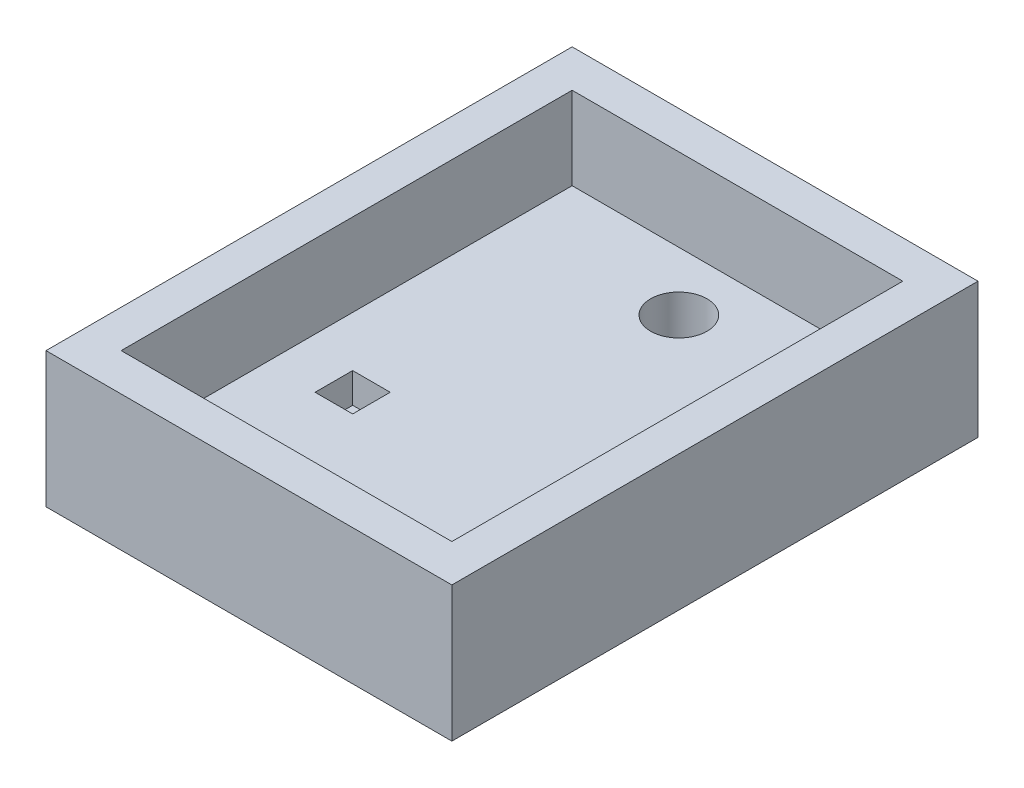
ISO-10303-21;
HEADER;
FILE_DESCRIPTION(('STEP AP214'),'2;1');
FILE_NAME('part.step','',(''),(''),'','','');
FILE_SCHEMA(('AUTOMOTIVE_DESIGN { 1 0 10303 214 1 1 1 1 }'));
ENDSEC;
DATA;
#1=APPLICATION_CONTEXT('core data for automotive mechanical design processes');
#2=APPLICATION_PROTOCOL_DEFINITION('international standard','automotive_design',2000,#1);
#3=PRODUCT_CONTEXT('',#1,'mechanical');
#4=PRODUCT('Part','Part','',(#3));
#5=PRODUCT_RELATED_PRODUCT_CATEGORY('part','',(#4));
#6=PRODUCT_DEFINITION_FORMATION('','',#4);
#7=PRODUCT_DEFINITION_CONTEXT('part definition',#1,'design');
#8=PRODUCT_DEFINITION('design','',#6,#7);
#9=PRODUCT_DEFINITION_SHAPE('','',#8);
#10=(LENGTH_UNIT() NAMED_UNIT(*) SI_UNIT(.MILLI.,.METRE.));
#11=(NAMED_UNIT(*) PLANE_ANGLE_UNIT() SI_UNIT($,.RADIAN.));
#12=(NAMED_UNIT(*) SI_UNIT($,.STERADIAN.) SOLID_ANGLE_UNIT());
#13=UNCERTAINTY_MEASURE_WITH_UNIT(LENGTH_MEASURE(1.E-05),#10,'distance_accuracy_value','');
#14=(GEOMETRIC_REPRESENTATION_CONTEXT(3) GLOBAL_UNCERTAINTY_ASSIGNED_CONTEXT((#13)) GLOBAL_UNIT_ASSIGNED_CONTEXT((#10,
#11,#12)) REPRESENTATION_CONTEXT('',''));
#15=CARTESIAN_POINT('',(0.,0.,0.));
#16=DIRECTION('',(0.,0.,1.));
#17=DIRECTION('',(1.,0.,0.));
#18=AXIS2_PLACEMENT_3D('',#15,#16,#17);
#19=CARTESIAN_POINT('',(0.,22.86,0.));
#20=DIRECTION('',(1.,0.,0.));
#21=DIRECTION('',(0.,0.,-1.));
#22=AXIS2_PLACEMENT_3D('',#19,#20,#21);
#23=PLANE('',#22);
#24=DIRECTION('',(0.,0.,1.));
#25=VECTOR('',#24,1.);
#26=CARTESIAN_POINT('',(0.,0.,0.));
#27=LINE('',#26,#25);
#28=CARTESIAN_POINT('',(0.,0.,-88.9));
#29=VERTEX_POINT('',#28);
#30=CARTESIAN_POINT('',(0.,0.,0.));
#31=VERTEX_POINT('',#30);
#32=EDGE_CURVE('E365',#29,#31,#27,.T.);
#33=ORIENTED_EDGE('',*,*,#32,.T.);
#34=DIRECTION('',(0.,-1.,0.));
#35=VECTOR('',#34,1.);
#36=CARTESIAN_POINT('',(0.,22.86,0.));
#37=LINE('',#36,#35);
#38=CARTESIAN_POINT('',(0.,22.86,0.));
#39=VERTEX_POINT('',#38);
#40=EDGE_CURVE('E12',#39,#31,#37,.T.);
#41=ORIENTED_EDGE('',*,*,#40,.F.);
#42=DIRECTION('',(0.,0.,1.));
#43=VECTOR('',#42,1.);
#44=CARTESIAN_POINT('',(0.,22.86,0.));
#45=LINE('',#44,#43);
#46=CARTESIAN_POINT('',(0.,22.86,-88.9));
#47=VERTEX_POINT('',#46);
#48=EDGE_CURVE('E366',#47,#39,#45,.T.);
#49=ORIENTED_EDGE('',*,*,#48,.F.);
#50=DIRECTION('',(0.,-1.,0.));
#51=VECTOR('',#50,1.);
#52=CARTESIAN_POINT('',(0.,22.86,-88.9));
#53=LINE('',#52,#51);
#54=EDGE_CURVE('E376',#47,#29,#53,.T.);
#55=ORIENTED_EDGE('',*,*,#54,.T.);
#56=EDGE_LOOP('',(#33,#41,#49,#55));
#57=FACE_BOUND('',#56,.T.);
#58=ADVANCED_FACE('F37',(#57),#23,.F.);
#59=CARTESIAN_POINT('',(0.,22.86,0.));
#60=DIRECTION('',(0.,0.,-1.));
#61=DIRECTION('',(-1.,0.,0.));
#62=AXIS2_PLACEMENT_3D('',#59,#60,#61);
#63=PLANE('',#62);
#64=DIRECTION('',(1.,0.,0.));
#65=VECTOR('',#64,1.);
#66=CARTESIAN_POINT('',(0.,0.,0.));
#67=LINE('',#66,#65);
#68=CARTESIAN_POINT('',(68.58,0.,0.));
#69=VERTEX_POINT('',#68);
#70=EDGE_CURVE('E379',#31,#69,#67,.T.);
#71=ORIENTED_EDGE('',*,*,#70,.T.);
#72=DIRECTION('',(0.,-1.,0.));
#73=VECTOR('',#72,1.);
#74=CARTESIAN_POINT('',(68.58,22.86,0.));
#75=LINE('',#74,#73);
#76=CARTESIAN_POINT('',(68.58,22.86,0.));
#77=VERTEX_POINT('',#76);
#78=EDGE_CURVE('E44',#77,#69,#75,.T.);
#79=ORIENTED_EDGE('',*,*,#78,.F.);
#80=DIRECTION('',(1.,0.,0.));
#81=VECTOR('',#80,1.);
#82=CARTESIAN_POINT('',(0.,22.86,0.));
#83=LINE('',#82,#81);
#84=EDGE_CURVE('E369',#39,#77,#83,.T.);
#85=ORIENTED_EDGE('',*,*,#84,.F.);
#86=ORIENTED_EDGE('',*,*,#40,.T.);
#87=EDGE_LOOP('',(#71,#79,#85,#86));
#88=FACE_BOUND('',#87,.T.);
#89=ADVANCED_FACE('F408',(#88),#63,.F.);
#90=CARTESIAN_POINT('',(68.58,22.86,0.));
#91=DIRECTION('',(-1.,0.,0.));
#92=DIRECTION('',(0.,0.,1.));
#93=AXIS2_PLACEMENT_3D('',#90,#91,#92);
#94=PLANE('',#93);
#95=DIRECTION('',(0.,0.,-1.));
#96=VECTOR('',#95,1.);
#97=CARTESIAN_POINT('',(68.58,0.,0.));
#98=LINE('',#97,#96);
#99=CARTESIAN_POINT('',(68.58,0.,-88.9));
#100=VERTEX_POINT('',#99);
#101=EDGE_CURVE('E381',#69,#100,#98,.T.);
#102=ORIENTED_EDGE('',*,*,#101,.T.);
#103=DIRECTION('',(0.,-1.,0.));
#104=VECTOR('',#103,1.);
#105=CARTESIAN_POINT('',(68.58,22.86,-88.9));
#106=LINE('',#105,#104);
#107=CARTESIAN_POINT('',(68.58,22.86,-88.9));
#108=VERTEX_POINT('',#107);
#109=EDGE_CURVE('E386',#108,#100,#106,.T.);
#110=ORIENTED_EDGE('',*,*,#109,.F.);
#111=DIRECTION('',(0.,0.,-1.));
#112=VECTOR('',#111,1.);
#113=CARTESIAN_POINT('',(68.58,22.86,0.));
#114=LINE('',#113,#112);
#115=EDGE_CURVE('E372',#77,#108,#114,.T.);
#116=ORIENTED_EDGE('',*,*,#115,.F.);
#117=ORIENTED_EDGE('',*,*,#78,.T.);
#118=EDGE_LOOP('',(#102,#110,#116,#117));
#119=FACE_BOUND('',#118,.T.);
#120=ADVANCED_FACE('F393',(#119),#94,.F.);
#121=CARTESIAN_POINT('',(0.,22.86,-88.9));
#122=DIRECTION('',(0.,0.,1.));
#123=DIRECTION('',(1.,0.,0.));
#124=AXIS2_PLACEMENT_3D('',#121,#122,#123);
#125=PLANE('',#124);
#126=DIRECTION('',(-1.,0.,0.));
#127=VECTOR('',#126,1.);
#128=CARTESIAN_POINT('',(0.,0.,-88.9));
#129=LINE('',#128,#127);
#130=EDGE_CURVE('E370',#100,#29,#129,.T.);
#131=ORIENTED_EDGE('',*,*,#130,.T.);
#132=ORIENTED_EDGE('',*,*,#54,.F.);
#133=DIRECTION('',(-1.,0.,0.));
#134=VECTOR('',#133,1.);
#135=CARTESIAN_POINT('',(0.,22.86,-88.9));
#136=LINE('',#135,#134);
#137=EDGE_CURVE('E374',#108,#47,#136,.T.);
#138=ORIENTED_EDGE('',*,*,#137,.F.);
#139=ORIENTED_EDGE('',*,*,#109,.T.);
#140=EDGE_LOOP('',(#131,#132,#138,#139));
#141=FACE_BOUND('',#140,.T.);
#142=ADVANCED_FACE('F401',(#141),#125,.F.);
#143=CARTESIAN_POINT('',(0.,22.86,0.));
#144=DIRECTION('',(0.,-1.,0.));
#145=DIRECTION('',(0.,0.,-1.));
#146=AXIS2_PLACEMENT_3D('',#143,#144,#145);
#147=PLANE('',#146);
#148=DIRECTION('',(0.,0.,1.));
#149=VECTOR('',#148,1.);
#150=CARTESIAN_POINT('',(6.35000000000002,22.86,-6.35000000000002));
#151=LINE('',#150,#149);
#152=CARTESIAN_POINT('',(6.35000000000002,22.86,-82.55));
#153=VERTEX_POINT('',#152);
#154=CARTESIAN_POINT('',(6.35000000000002,22.86,-6.35000000000002));
#155=VERTEX_POINT('',#154);
#156=EDGE_CURVE('E337',#153,#155,#151,.T.);
#157=ORIENTED_EDGE('',*,*,#156,.F.);
#158=DIRECTION('',(-1.,0.,0.));
#159=VECTOR('',#158,1.);
#160=CARTESIAN_POINT('',(6.35000000000002,22.86,-82.55));
#161=LINE('',#160,#159);
#162=CARTESIAN_POINT('',(62.23,22.86,-82.55));
#163=VERTEX_POINT('',#162);
#164=EDGE_CURVE('E340',#163,#153,#161,.T.);
#165=ORIENTED_EDGE('',*,*,#164,.F.);
#166=DIRECTION('',(0.,0.,-1.));
#167=VECTOR('',#166,1.);
#168=CARTESIAN_POINT('',(62.23,22.86,-6.35000000000002));
#169=LINE('',#168,#167);
#170=CARTESIAN_POINT('',(62.23,22.86,-6.35000000000002));
#171=VERTEX_POINT('',#170);
#172=EDGE_CURVE('E327',#171,#163,#169,.T.);
#173=ORIENTED_EDGE('',*,*,#172,.F.);
#174=DIRECTION('',(1.,0.,0.));
#175=VECTOR('',#174,1.);
#176=CARTESIAN_POINT('',(6.35000000000002,22.86,-6.35000000000002));
#177=LINE('',#176,#175);
#178=EDGE_CURVE('E334',#155,#171,#177,.T.);
#179=ORIENTED_EDGE('',*,*,#178,.F.);
#180=EDGE_LOOP('',(#157,#165,#173,#179));
#181=FACE_BOUND('',#180,.T.);
#182=ORIENTED_EDGE('',*,*,#48,.T.);
#183=ORIENTED_EDGE('',*,*,#84,.T.);
#184=ORIENTED_EDGE('',*,*,#115,.T.);
#185=ORIENTED_EDGE('',*,*,#137,.T.);
#186=EDGE_LOOP('',(#182,#183,#184,#185));
#187=FACE_BOUND('',#186,.T.);
#188=ADVANCED_FACE('F407',(#181,#187),#147,.F.);
#189=CARTESIAN_POINT('',(0.,0.,0.));
#190=DIRECTION('',(0.,-1.,0.));
#191=DIRECTION('',(0.,0.,-1.));
#192=AXIS2_PLACEMENT_3D('',#189,#190,#191);
#193=PLANE('',#192);
#194=CARTESIAN_POINT('',(34.29,0.,-72.644));
#195=DIRECTION('',(0.,1.,0.));
#196=DIRECTION('',(0.,0.,1.));
#197=AXIS2_PLACEMENT_3D('',#194,#195,#196);
#198=CIRCLE('',#197,4.7625);
#199=CARTESIAN_POINT('',(34.29,0.,-67.8815));
#200=VERTEX_POINT('',#199);
#201=EDGE_CURVE('E228',#200,#200,#198,.T.);
#202=ORIENTED_EDGE('',*,*,#201,.T.);
#203=EDGE_LOOP('',(#202));
#204=FACE_BOUND('',#203,.T.);
#205=DIRECTION('',(0.,0.,1.));
#206=VECTOR('',#205,1.);
#207=CARTESIAN_POINT('',(16.764,0.,-12.446));
#208=LINE('',#207,#206);
#209=CARTESIAN_POINT('',(16.764,0.,-14.986));
#210=VERTEX_POINT('',#209);
#211=CARTESIAN_POINT('',(16.764,0.,-12.446));
#212=VERTEX_POINT('',#211);
#213=EDGE_CURVE('E199',#210,#212,#208,.T.);
#214=ORIENTED_EDGE('',*,*,#213,.T.);
#215=DIRECTION('',(1.,0.,0.));
#216=VECTOR('',#215,1.);
#217=CARTESIAN_POINT('',(16.764,0.,-12.446));
#218=LINE('',#217,#216);
#219=CARTESIAN_POINT('',(19.304,0.,-12.446));
#220=VERTEX_POINT('',#219);
#221=EDGE_CURVE('E208',#212,#220,#218,.T.);
#222=ORIENTED_EDGE('',*,*,#221,.T.);
#223=DIRECTION('',(0.,0.,-1.));
#224=VECTOR('',#223,1.);
#225=CARTESIAN_POINT('',(19.304,0.,-12.446));
#226=LINE('',#225,#224);
#227=CARTESIAN_POINT('',(19.304,0.,-14.986));
#228=VERTEX_POINT('',#227);
#229=EDGE_CURVE('E51',#220,#228,#226,.T.);
#230=ORIENTED_EDGE('',*,*,#229,.T.);
#231=DIRECTION('',(-1.,0.,0.));
#232=VECTOR('',#231,1.);
#233=CARTESIAN_POINT('',(16.764,0.,-14.986));
#234=LINE('',#233,#232);
#235=EDGE_CURVE('E205',#228,#210,#234,.T.);
#236=ORIENTED_EDGE('',*,*,#235,.T.);
#237=EDGE_LOOP('',(#214,#222,#230,#236));
#238=FACE_BOUND('',#237,.T.);
#239=DIRECTION('',(0.,0.,1.));
#240=VECTOR('',#239,1.);
#241=CARTESIAN_POINT('',(16.764,0.,-32.512));
#242=LINE('',#241,#240);
#243=CARTESIAN_POINT('',(16.764,0.,-35.052));
#244=VERTEX_POINT('',#243);
#245=CARTESIAN_POINT('',(16.764,0.,-32.512));
#246=VERTEX_POINT('',#245);
#247=EDGE_CURVE('E238',#244,#246,#242,.T.);
#248=ORIENTED_EDGE('',*,*,#247,.T.);
#249=DIRECTION('',(1.,0.,0.));
#250=VECTOR('',#249,1.);
#251=CARTESIAN_POINT('',(16.764,0.,-32.512));
#252=LINE('',#251,#250);
#253=CARTESIAN_POINT('',(19.304,0.,-32.512));
#254=VERTEX_POINT('',#253);
#255=EDGE_CURVE('E241',#246,#254,#252,.T.);
#256=ORIENTED_EDGE('',*,*,#255,.T.);
#257=DIRECTION('',(0.,0.,-1.));
#258=VECTOR('',#257,1.);
#259=CARTESIAN_POINT('',(19.304,0.,-32.512));
#260=LINE('',#259,#258);
#261=CARTESIAN_POINT('',(19.304,0.,-35.052));
#262=VERTEX_POINT('',#261);
#263=EDGE_CURVE('E245',#254,#262,#260,.T.);
#264=ORIENTED_EDGE('',*,*,#263,.T.);
#265=DIRECTION('',(-1.,0.,0.));
#266=VECTOR('',#265,1.);
#267=CARTESIAN_POINT('',(16.764,0.,-35.052));
#268=LINE('',#267,#266);
#269=EDGE_CURVE('E248',#262,#244,#268,.T.);
#270=ORIENTED_EDGE('',*,*,#269,.T.);
#271=EDGE_LOOP('',(#248,#256,#264,#270));
#272=FACE_BOUND('',#271,.T.);
#273=ORIENTED_EDGE('',*,*,#32,.F.);
#274=ORIENTED_EDGE('',*,*,#130,.F.);
#275=ORIENTED_EDGE('',*,*,#101,.F.);
#276=ORIENTED_EDGE('',*,*,#70,.F.);
#277=EDGE_LOOP('',(#273,#274,#275,#276));
#278=FACE_BOUND('',#277,.T.);
#279=ADVANCED_FACE('F212',(#204,#238,#272,#278),#193,.T.);
#280=CARTESIAN_POINT('',(0.,8.89,0.));
#281=DIRECTION('',(0.,-1.,0.));
#282=DIRECTION('',(0.,0.,-1.));
#283=AXIS2_PLACEMENT_3D('',#280,#281,#282);
#284=PLANE('',#283);
#285=CARTESIAN_POINT('',(34.29,8.89,-72.644));
#286=DIRECTION('',(0.,1.,0.));
#287=DIRECTION('',(0.,0.,1.));
#288=AXIS2_PLACEMENT_3D('',#285,#286,#287);
#289=CIRCLE('',#288,4.7625);
#290=CARTESIAN_POINT('',(34.29,8.89,-67.8815));
#291=VERTEX_POINT('',#290);
#292=EDGE_CURVE('E221',#291,#291,#289,.T.);
#293=ORIENTED_EDGE('',*,*,#292,.F.);
#294=EDGE_LOOP('',(#293));
#295=FACE_BOUND('',#294,.T.);
#296=DIRECTION('',(1.,0.,0.));
#297=VECTOR('',#296,1.);
#298=CARTESIAN_POINT('',(14.859,8.89,-10.541));
#299=LINE('',#298,#297);
#300=CARTESIAN_POINT('',(14.859,8.89,-10.541));
#301=VERTEX_POINT('',#300);
#302=CARTESIAN_POINT('',(21.209,8.89,-10.541));
#303=VERTEX_POINT('',#302);
#304=EDGE_CURVE('E285',#301,#303,#299,.T.);
#305=ORIENTED_EDGE('',*,*,#304,.F.);
#306=DIRECTION('',(0.,0.,1.));
#307=VECTOR('',#306,1.);
#308=CARTESIAN_POINT('',(14.859,8.89,-16.891));
#309=LINE('',#308,#307);
#310=CARTESIAN_POINT('',(14.859,8.89,-16.891));
#311=VERTEX_POINT('',#310);
#312=EDGE_CURVE('E263',#311,#301,#309,.T.);
#313=ORIENTED_EDGE('',*,*,#312,.F.);
#314=DIRECTION('',(-1.,0.,0.));
#315=VECTOR('',#314,1.);
#316=CARTESIAN_POINT('',(14.859,8.89,-16.891));
#317=LINE('',#316,#315);
#318=CARTESIAN_POINT('',(21.209,8.89,-16.891));
#319=VERTEX_POINT('',#318);
#320=EDGE_CURVE('E274',#319,#311,#317,.T.);
#321=ORIENTED_EDGE('',*,*,#320,.F.);
#322=DIRECTION('',(0.,0.,-1.));
#323=VECTOR('',#322,1.);
#324=CARTESIAN_POINT('',(21.209,8.89,-16.891));
#325=LINE('',#324,#323);
#326=EDGE_CURVE('E288',#303,#319,#325,.T.);
#327=ORIENTED_EDGE('',*,*,#326,.F.);
#328=EDGE_LOOP('',(#305,#313,#321,#327));
#329=FACE_BOUND('',#328,.T.);
#330=DIRECTION('',(-1.,0.,0.));
#331=VECTOR('',#330,1.);
#332=CARTESIAN_POINT('',(21.209,8.89,-36.957));
#333=LINE('',#332,#331);
#334=CARTESIAN_POINT('',(21.209,8.89,-36.957));
#335=VERTEX_POINT('',#334);
#336=CARTESIAN_POINT('',(14.859,8.89,-36.957));
#337=VERTEX_POINT('',#336);
#338=EDGE_CURVE('E317',#335,#337,#333,.T.);
#339=ORIENTED_EDGE('',*,*,#338,.F.);
#340=DIRECTION('',(0.,0.,-1.));
#341=VECTOR('',#340,1.);
#342=CARTESIAN_POINT('',(21.209,8.89,-36.957));
#343=LINE('',#342,#341);
#344=CARTESIAN_POINT('',(21.209,8.89,-30.607));
#345=VERTEX_POINT('',#344);
#346=EDGE_CURVE('E295',#345,#335,#343,.T.);
#347=ORIENTED_EDGE('',*,*,#346,.F.);
#348=DIRECTION('',(1.,0.,0.));
#349=VECTOR('',#348,1.);
#350=CARTESIAN_POINT('',(21.209,8.89,-30.607));
#351=LINE('',#350,#349);
#352=CARTESIAN_POINT('',(14.859,8.89,-30.607));
#353=VERTEX_POINT('',#352);
#354=EDGE_CURVE('E306',#353,#345,#351,.T.);
#355=ORIENTED_EDGE('',*,*,#354,.F.);
#356=DIRECTION('',(0.,0.,1.));
#357=VECTOR('',#356,1.);
#358=CARTESIAN_POINT('',(14.859,8.89,-36.957));
#359=LINE('',#358,#357);
#360=EDGE_CURVE('E320',#337,#353,#359,.T.);
#361=ORIENTED_EDGE('',*,*,#360,.F.);
#362=EDGE_LOOP('',(#339,#347,#355,#361));
#363=FACE_BOUND('',#362,.T.);
#364=DIRECTION('',(0.,0.,-1.));
#365=VECTOR('',#364,1.);
#366=CARTESIAN_POINT('',(62.23,8.89,-6.35000000000002));
#367=LINE('',#366,#365);
#368=CARTESIAN_POINT('',(62.23,8.89,-6.35000000000002));
#369=VERTEX_POINT('',#368);
#370=CARTESIAN_POINT('',(62.23,8.89,-82.55));
#371=VERTEX_POINT('',#370);
#372=EDGE_CURVE('E348',#369,#371,#367,.T.);
#373=ORIENTED_EDGE('',*,*,#372,.T.);
#374=DIRECTION('',(-1.,0.,0.));
#375=VECTOR('',#374,1.);
#376=CARTESIAN_POINT('',(6.35000000000002,8.89,-82.55));
#377=LINE('',#376,#375);
#378=CARTESIAN_POINT('',(6.35000000000002,8.89,-82.55));
#379=VERTEX_POINT('',#378);
#380=EDGE_CURVE('E336',#371,#379,#377,.T.);
#381=ORIENTED_EDGE('',*,*,#380,.T.);
#382=DIRECTION('',(0.,0.,1.));
#383=VECTOR('',#382,1.);
#384=CARTESIAN_POINT('',(6.35000000000002,8.89,-6.35000000000002));
#385=LINE('',#384,#383);
#386=CARTESIAN_POINT('',(6.35000000000002,8.89,-6.35000000000002));
#387=VERTEX_POINT('',#386);
#388=EDGE_CURVE('E357',#379,#387,#385,.T.);
#389=ORIENTED_EDGE('',*,*,#388,.T.);
#390=DIRECTION('',(1.,0.,0.));
#391=VECTOR('',#390,1.);
#392=CARTESIAN_POINT('',(6.35000000000002,8.89,-6.35000000000002));
#393=LINE('',#392,#391);
#394=EDGE_CURVE('E353',#387,#369,#393,.T.);
#395=ORIENTED_EDGE('',*,*,#394,.T.);
#396=EDGE_LOOP('',(#373,#381,#389,#395));
#397=FACE_BOUND('',#396,.T.);
#398=ADVANCED_FACE('F420',(#295,#329,#363,#397),#284,.F.);
#399=CARTESIAN_POINT('',(6.35000000000002,-94.4934622077104,-82.55));
#400=DIRECTION('',(0.,0.,-1.));
#401=DIRECTION('',(-1.,0.,0.));
#402=AXIS2_PLACEMENT_3D('',#399,#400,#401);
#403=PLANE('',#402);
#404=DIRECTION('',(0.,1.,0.));
#405=VECTOR('',#404,1.);
#406=CARTESIAN_POINT('',(62.23,-94.4934622077104,-82.55));
#407=LINE('',#406,#405);
#408=EDGE_CURVE('E351',#371,#163,#407,.T.);
#409=ORIENTED_EDGE('',*,*,#408,.T.);
#410=ORIENTED_EDGE('',*,*,#164,.T.);
#411=DIRECTION('',(0.,1.,0.));
#412=VECTOR('',#411,1.);
#413=CARTESIAN_POINT('',(6.35000000000002,-94.4934622077104,-82.55));
#414=LINE('',#413,#412);
#415=EDGE_CURVE('E347',#379,#153,#414,.T.);
#416=ORIENTED_EDGE('',*,*,#415,.F.);
#417=ORIENTED_EDGE('',*,*,#380,.F.);
#418=EDGE_LOOP('',(#409,#410,#416,#417));
#419=FACE_BOUND('',#418,.T.);
#420=ADVANCED_FACE('F427',(#419),#403,.F.);
#421=CARTESIAN_POINT('',(6.35000000000002,-94.4934622077104,-6.35000000000002));
#422=DIRECTION('',(-1.,0.,0.));
#423=DIRECTION('',(0.,0.,1.));
#424=AXIS2_PLACEMENT_3D('',#421,#422,#423);
#425=PLANE('',#424);
#426=ORIENTED_EDGE('',*,*,#415,.T.);
#427=ORIENTED_EDGE('',*,*,#156,.T.);
#428=DIRECTION('',(0.,1.,0.));
#429=VECTOR('',#428,1.);
#430=CARTESIAN_POINT('',(6.35000000000002,-94.4934622077104,-6.35000000000002));
#431=LINE('',#430,#429);
#432=EDGE_CURVE('E356',#387,#155,#431,.T.);
#433=ORIENTED_EDGE('',*,*,#432,.F.);
#434=ORIENTED_EDGE('',*,*,#388,.F.);
#435=EDGE_LOOP('',(#426,#427,#433,#434));
#436=FACE_BOUND('',#435,.T.);
#437=ADVANCED_FACE('F431',(#436),#425,.F.);
#438=CARTESIAN_POINT('',(6.35000000000002,-94.4934622077104,-6.35000000000002));
#439=DIRECTION('',(0.,0.,1.));
#440=DIRECTION('',(1.,0.,0.));
#441=AXIS2_PLACEMENT_3D('',#438,#439,#440);
#442=PLANE('',#441);
#443=ORIENTED_EDGE('',*,*,#432,.T.);
#444=ORIENTED_EDGE('',*,*,#178,.T.);
#445=DIRECTION('',(0.,1.,0.));
#446=VECTOR('',#445,1.);
#447=CARTESIAN_POINT('',(62.23,-94.4934622077104,-6.35000000000002));
#448=LINE('',#447,#446);
#449=EDGE_CURVE('E352',#369,#171,#448,.T.);
#450=ORIENTED_EDGE('',*,*,#449,.F.);
#451=ORIENTED_EDGE('',*,*,#394,.F.);
#452=EDGE_LOOP('',(#443,#444,#450,#451));
#453=FACE_BOUND('',#452,.T.);
#454=ADVANCED_FACE('F435',(#453),#442,.F.);
#455=CARTESIAN_POINT('',(62.23,-94.4934622077104,-6.35000000000002));
#456=DIRECTION('',(1.,0.,0.));
#457=DIRECTION('',(0.,0.,-1.));
#458=AXIS2_PLACEMENT_3D('',#455,#456,#457);
#459=PLANE('',#458);
#460=ORIENTED_EDGE('',*,*,#449,.T.);
#461=ORIENTED_EDGE('',*,*,#172,.T.);
#462=ORIENTED_EDGE('',*,*,#408,.F.);
#463=ORIENTED_EDGE('',*,*,#372,.F.);
#464=EDGE_LOOP('',(#460,#461,#462,#463));
#465=FACE_BOUND('',#464,.T.);
#466=ADVANCED_FACE('F439',(#465),#459,.F.);
#467=CARTESIAN_POINT('',(21.209,3.81,-36.957));
#468=DIRECTION('',(1.,0.,0.));
#469=DIRECTION('',(0.,0.,-1.));
#470=AXIS2_PLACEMENT_3D('',#467,#468,#469);
#471=PLANE('',#470);
#472=ORIENTED_EDGE('',*,*,#346,.T.);
#473=DIRECTION('',(0.,1.,0.));
#474=VECTOR('',#473,1.);
#475=CARTESIAN_POINT('',(21.209,3.81,-36.957));
#476=LINE('',#475,#474);
#477=CARTESIAN_POINT('',(21.209,3.81,-36.957));
#478=VERTEX_POINT('',#477);
#479=EDGE_CURVE('E315',#478,#335,#476,.T.);
#480=ORIENTED_EDGE('',*,*,#479,.F.);
#481=DIRECTION('',(0.,0.,-1.));
#482=VECTOR('',#481,1.);
#483=CARTESIAN_POINT('',(21.209,3.81,-36.957));
#484=LINE('',#483,#482);
#485=CARTESIAN_POINT('',(21.209,3.81,-30.607));
#486=VERTEX_POINT('',#485);
#487=EDGE_CURVE('E302',#486,#478,#484,.T.);
#488=ORIENTED_EDGE('',*,*,#487,.F.);
#489=DIRECTION('',(0.,1.,0.));
#490=VECTOR('',#489,1.);
#491=CARTESIAN_POINT('',(21.209,3.81,-30.607));
#492=LINE('',#491,#490);
#493=EDGE_CURVE('E325',#486,#345,#492,.T.);
#494=ORIENTED_EDGE('',*,*,#493,.T.);
#495=EDGE_LOOP('',(#472,#480,#488,#494));
#496=FACE_BOUND('',#495,.T.);
#497=ADVANCED_FACE('F443',(#496),#471,.F.);
#498=CARTESIAN_POINT('',(21.209,3.81,-30.607));
#499=DIRECTION('',(0.,0.,1.));
#500=DIRECTION('',(1.,0.,0.));
#501=AXIS2_PLACEMENT_3D('',#498,#499,#500);
#502=PLANE('',#501);
#503=ORIENTED_EDGE('',*,*,#354,.T.);
#504=ORIENTED_EDGE('',*,*,#493,.F.);
#505=DIRECTION('',(1.,0.,0.));
#506=VECTOR('',#505,1.);
#507=CARTESIAN_POINT('',(21.209,3.81,-30.607));
#508=LINE('',#507,#506);
#509=CARTESIAN_POINT('',(14.859,3.81,-30.607));
#510=VERTEX_POINT('',#509);
#511=EDGE_CURVE('E312',#510,#486,#508,.T.);
#512=ORIENTED_EDGE('',*,*,#511,.F.);
#513=DIRECTION('',(0.,1.,0.));
#514=VECTOR('',#513,1.);
#515=CARTESIAN_POINT('',(14.859,3.81,-30.607));
#516=LINE('',#515,#514);
#517=EDGE_CURVE('E328',#510,#353,#516,.T.);
#518=ORIENTED_EDGE('',*,*,#517,.T.);
#519=EDGE_LOOP('',(#503,#504,#512,#518));
#520=FACE_BOUND('',#519,.T.);
#521=ADVANCED_FACE('F447',(#520),#502,.F.);
#522=CARTESIAN_POINT('',(14.859,3.81,-36.957));
#523=DIRECTION('',(-1.,0.,0.));
#524=DIRECTION('',(0.,0.,1.));
#525=AXIS2_PLACEMENT_3D('',#522,#523,#524);
#526=PLANE('',#525);
#527=ORIENTED_EDGE('',*,*,#360,.T.);
#528=ORIENTED_EDGE('',*,*,#517,.F.);
#529=DIRECTION('',(0.,0.,1.));
#530=VECTOR('',#529,1.);
#531=CARTESIAN_POINT('',(14.859,3.81,-36.957));
#532=LINE('',#531,#530);
#533=CARTESIAN_POINT('',(14.859,3.81,-36.957));
#534=VERTEX_POINT('',#533);
#535=EDGE_CURVE('E309',#534,#510,#532,.T.);
#536=ORIENTED_EDGE('',*,*,#535,.F.);
#537=DIRECTION('',(0.,1.,0.));
#538=VECTOR('',#537,1.);
#539=CARTESIAN_POINT('',(14.859,3.81,-36.957));
#540=LINE('',#539,#538);
#541=EDGE_CURVE('E330',#534,#337,#540,.T.);
#542=ORIENTED_EDGE('',*,*,#541,.T.);
#543=EDGE_LOOP('',(#527,#528,#536,#542));
#544=FACE_BOUND('',#543,.T.);
#545=ADVANCED_FACE('F453',(#544),#526,.F.);
#546=CARTESIAN_POINT('',(21.209,3.81,-36.957));
#547=DIRECTION('',(0.,0.,-1.));
#548=DIRECTION('',(-1.,0.,0.));
#549=AXIS2_PLACEMENT_3D('',#546,#547,#548);
#550=PLANE('',#549);
#551=ORIENTED_EDGE('',*,*,#338,.T.);
#552=ORIENTED_EDGE('',*,*,#541,.F.);
#553=DIRECTION('',(-1.,0.,0.));
#554=VECTOR('',#553,1.);
#555=CARTESIAN_POINT('',(21.209,3.81,-36.957));
#556=LINE('',#555,#554);
#557=EDGE_CURVE('E305',#478,#534,#556,.T.);
#558=ORIENTED_EDGE('',*,*,#557,.F.);
#559=ORIENTED_EDGE('',*,*,#479,.T.);
#560=EDGE_LOOP('',(#551,#552,#558,#559));
#561=FACE_BOUND('',#560,.T.);
#562=ADVANCED_FACE('F449',(#561),#550,.F.);
#563=CARTESIAN_POINT('',(0.,3.81,0.));
#564=DIRECTION('',(0.,-1.,0.));
#565=DIRECTION('',(0.,0.,-1.));
#566=AXIS2_PLACEMENT_3D('',#563,#564,#565);
#567=PLANE('',#566);
#568=DIRECTION('',(1.,0.,0.));
#569=VECTOR('',#568,1.);
#570=CARTESIAN_POINT('',(16.764,3.81,-32.512));
#571=LINE('',#570,#569);
#572=CARTESIAN_POINT('',(16.764,3.81,-32.512));
#573=VERTEX_POINT('',#572);
#574=CARTESIAN_POINT('',(19.304,3.81,-32.512));
#575=VERTEX_POINT('',#574);
#576=EDGE_CURVE('E253',#573,#575,#571,.T.);
#577=ORIENTED_EDGE('',*,*,#576,.F.);
#578=DIRECTION('',(0.,0.,1.));
#579=VECTOR('',#578,1.);
#580=CARTESIAN_POINT('',(16.764,3.81,-32.512));
#581=LINE('',#580,#579);
#582=CARTESIAN_POINT('',(16.764,3.81,-35.052));
#583=VERTEX_POINT('',#582);
#584=EDGE_CURVE('E234',#583,#573,#581,.T.);
#585=ORIENTED_EDGE('',*,*,#584,.F.);
#586=DIRECTION('',(-1.,0.,0.));
#587=VECTOR('',#586,1.);
#588=CARTESIAN_POINT('',(16.764,3.81,-35.052));
#589=LINE('',#588,#587);
#590=CARTESIAN_POINT('',(19.304,3.81,-35.052));
#591=VERTEX_POINT('',#590);
#592=EDGE_CURVE('E242',#591,#583,#589,.T.);
#593=ORIENTED_EDGE('',*,*,#592,.F.);
#594=DIRECTION('',(0.,0.,-1.));
#595=VECTOR('',#594,1.);
#596=CARTESIAN_POINT('',(19.304,3.81,-32.512));
#597=LINE('',#596,#595);
#598=EDGE_CURVE('E256',#575,#591,#597,.T.);
#599=ORIENTED_EDGE('',*,*,#598,.F.);
#600=EDGE_LOOP('',(#577,#585,#593,#599));
#601=FACE_BOUND('',#600,.T.);
#602=ORIENTED_EDGE('',*,*,#487,.T.);
#603=ORIENTED_EDGE('',*,*,#557,.T.);
#604=ORIENTED_EDGE('',*,*,#535,.T.);
#605=ORIENTED_EDGE('',*,*,#511,.T.);
#606=EDGE_LOOP('',(#602,#603,#604,#605));
#607=FACE_BOUND('',#606,.T.);
#608=ADVANCED_FACE('F452',(#601,#607),#567,.F.);
#609=CARTESIAN_POINT('',(14.859,3.81,-16.891));
#610=DIRECTION('',(-1.,0.,0.));
#611=DIRECTION('',(0.,0.,1.));
#612=AXIS2_PLACEMENT_3D('',#609,#610,#611);
#613=PLANE('',#612);
#614=ORIENTED_EDGE('',*,*,#312,.T.);
#615=DIRECTION('',(0.,1.,0.));
#616=VECTOR('',#615,1.);
#617=CARTESIAN_POINT('',(14.859,3.81,-10.541));
#618=LINE('',#617,#616);
#619=CARTESIAN_POINT('',(14.859,3.81,-10.541));
#620=VERTEX_POINT('',#619);
#621=EDGE_CURVE('E283',#620,#301,#618,.T.);
#622=ORIENTED_EDGE('',*,*,#621,.F.);
#623=DIRECTION('',(0.,0.,1.));
#624=VECTOR('',#623,1.);
#625=CARTESIAN_POINT('',(14.859,3.81,-16.891));
#626=LINE('',#625,#624);
#627=CARTESIAN_POINT('',(14.859,3.81,-16.891));
#628=VERTEX_POINT('',#627);
#629=EDGE_CURVE('E270',#628,#620,#626,.T.);
#630=ORIENTED_EDGE('',*,*,#629,.F.);
#631=DIRECTION('',(0.,1.,0.));
#632=VECTOR('',#631,1.);
#633=CARTESIAN_POINT('',(14.859,3.81,-16.891));
#634=LINE('',#633,#632);
#635=EDGE_CURVE('E293',#628,#311,#634,.T.);
#636=ORIENTED_EDGE('',*,*,#635,.T.);
#637=EDGE_LOOP('',(#614,#622,#630,#636));
#638=FACE_BOUND('',#637,.T.);
#639=ADVANCED_FACE('F463',(#638),#613,.F.);
#640=CARTESIAN_POINT('',(14.859,3.81,-16.891));
#641=DIRECTION('',(0.,0.,-1.));
#642=DIRECTION('',(-1.,0.,0.));
#643=AXIS2_PLACEMENT_3D('',#640,#641,#642);
#644=PLANE('',#643);
#645=ORIENTED_EDGE('',*,*,#320,.T.);
#646=ORIENTED_EDGE('',*,*,#635,.F.);
#647=DIRECTION('',(-1.,0.,0.));
#648=VECTOR('',#647,1.);
#649=CARTESIAN_POINT('',(14.859,3.81,-16.891));
#650=LINE('',#649,#648);
#651=CARTESIAN_POINT('',(21.209,3.81,-16.891));
#652=VERTEX_POINT('',#651);
#653=EDGE_CURVE('E280',#652,#628,#650,.T.);
#654=ORIENTED_EDGE('',*,*,#653,.F.);
#655=DIRECTION('',(0.,1.,0.));
#656=VECTOR('',#655,1.);
#657=CARTESIAN_POINT('',(21.209,3.81,-16.891));
#658=LINE('',#657,#656);
#659=EDGE_CURVE('E296',#652,#319,#658,.T.);
#660=ORIENTED_EDGE('',*,*,#659,.T.);
#661=EDGE_LOOP('',(#645,#646,#654,#660));
#662=FACE_BOUND('',#661,.T.);
#663=ADVANCED_FACE('F467',(#662),#644,.F.);
#664=CARTESIAN_POINT('',(21.209,3.81,-16.891));
#665=DIRECTION('',(1.,0.,0.));
#666=DIRECTION('',(0.,0.,-1.));
#667=AXIS2_PLACEMENT_3D('',#664,#665,#666);
#668=PLANE('',#667);
#669=ORIENTED_EDGE('',*,*,#326,.T.);
#670=ORIENTED_EDGE('',*,*,#659,.F.);
#671=DIRECTION('',(0.,0.,-1.));
#672=VECTOR('',#671,1.);
#673=CARTESIAN_POINT('',(21.209,3.81,-16.891));
#674=LINE('',#673,#672);
#675=CARTESIAN_POINT('',(21.209,3.81,-10.541));
#676=VERTEX_POINT('',#675);
#677=EDGE_CURVE('E277',#676,#652,#674,.T.);
#678=ORIENTED_EDGE('',*,*,#677,.F.);
#679=DIRECTION('',(0.,1.,0.));
#680=VECTOR('',#679,1.);
#681=CARTESIAN_POINT('',(21.209,3.81,-10.541));
#682=LINE('',#681,#680);
#683=EDGE_CURVE('E298',#676,#303,#682,.T.);
#684=ORIENTED_EDGE('',*,*,#683,.T.);
#685=EDGE_LOOP('',(#669,#670,#678,#684));
#686=FACE_BOUND('',#685,.T.);
#687=ADVANCED_FACE('F473',(#686),#668,.F.);
#688=CARTESIAN_POINT('',(14.859,3.81,-10.541));
#689=DIRECTION('',(0.,0.,1.));
#690=DIRECTION('',(1.,0.,0.));
#691=AXIS2_PLACEMENT_3D('',#688,#689,#690);
#692=PLANE('',#691);
#693=ORIENTED_EDGE('',*,*,#304,.T.);
#694=ORIENTED_EDGE('',*,*,#683,.F.);
#695=DIRECTION('',(1.,0.,0.));
#696=VECTOR('',#695,1.);
#697=CARTESIAN_POINT('',(14.859,3.81,-10.541));
#698=LINE('',#697,#696);
#699=EDGE_CURVE('E273',#620,#676,#698,.T.);
#700=ORIENTED_EDGE('',*,*,#699,.F.);
#701=ORIENTED_EDGE('',*,*,#621,.T.);
#702=EDGE_LOOP('',(#693,#694,#700,#701));
#703=FACE_BOUND('',#702,.T.);
#704=ADVANCED_FACE('F469',(#703),#692,.F.);
#705=CARTESIAN_POINT('',(0.,3.81,0.));
#706=DIRECTION('',(0.,1.,0.));
#707=DIRECTION('',(0.,0.,1.));
#708=AXIS2_PLACEMENT_3D('',#705,#706,#707);
#709=PLANE('',#708);
#710=DIRECTION('',(0.,0.,1.));
#711=VECTOR('',#710,1.);
#712=CARTESIAN_POINT('',(16.764,3.81,-12.446));
#713=LINE('',#712,#711);
#714=CARTESIAN_POINT('',(16.764,3.81,-14.986));
#715=VERTEX_POINT('',#714);
#716=CARTESIAN_POINT('',(16.764,3.81,-12.446));
#717=VERTEX_POINT('',#716);
#718=EDGE_CURVE('E59',#715,#717,#713,.T.);
#719=ORIENTED_EDGE('',*,*,#718,.F.);
#720=DIRECTION('',(-1.,0.,0.));
#721=VECTOR('',#720,1.);
#722=CARTESIAN_POINT('',(16.764,3.81,-14.986));
#723=LINE('',#722,#721);
#724=CARTESIAN_POINT('',(19.304,3.81,-14.986));
#725=VERTEX_POINT('',#724);
#726=EDGE_CURVE('E215',#725,#715,#723,.T.);
#727=ORIENTED_EDGE('',*,*,#726,.F.);
#728=DIRECTION('',(0.,0.,-1.));
#729=VECTOR('',#728,1.);
#730=CARTESIAN_POINT('',(19.304,3.81,-12.446));
#731=LINE('',#730,#729);
#732=CARTESIAN_POINT('',(19.304,3.81,-12.446));
#733=VERTEX_POINT('',#732);
#734=EDGE_CURVE('E218',#733,#725,#731,.T.);
#735=ORIENTED_EDGE('',*,*,#734,.F.);
#736=DIRECTION('',(1.,0.,0.));
#737=VECTOR('',#736,1.);
#738=CARTESIAN_POINT('',(16.764,3.81,-12.446));
#739=LINE('',#738,#737);
#740=EDGE_CURVE('E227',#717,#733,#739,.T.);
#741=ORIENTED_EDGE('',*,*,#740,.F.);
#742=EDGE_LOOP('',(#719,#727,#735,#741));
#743=FACE_BOUND('',#742,.T.);
#744=ORIENTED_EDGE('',*,*,#629,.T.);
#745=ORIENTED_EDGE('',*,*,#699,.T.);
#746=ORIENTED_EDGE('',*,*,#677,.T.);
#747=ORIENTED_EDGE('',*,*,#653,.T.);
#748=EDGE_LOOP('',(#744,#745,#746,#747));
#749=FACE_BOUND('',#748,.T.);
#750=ADVANCED_FACE('F472',(#743,#749),#709,.T.);
#751=CARTESIAN_POINT('',(16.764,0.,-32.512));
#752=DIRECTION('',(-1.,0.,0.));
#753=DIRECTION('',(0.,0.,1.));
#754=AXIS2_PLACEMENT_3D('',#751,#752,#753);
#755=PLANE('',#754);
#756=ORIENTED_EDGE('',*,*,#584,.T.);
#757=DIRECTION('',(0.,1.,0.));
#758=VECTOR('',#757,1.);
#759=CARTESIAN_POINT('',(16.764,0.,-32.512));
#760=LINE('',#759,#758);
#761=EDGE_CURVE('E251',#246,#573,#760,.T.);
#762=ORIENTED_EDGE('',*,*,#761,.F.);
#763=ORIENTED_EDGE('',*,*,#247,.F.);
#764=DIRECTION('',(0.,1.,0.));
#765=VECTOR('',#764,1.);
#766=CARTESIAN_POINT('',(16.764,0.,-35.052));
#767=LINE('',#766,#765);
#768=EDGE_CURVE('E261',#244,#583,#767,.T.);
#769=ORIENTED_EDGE('',*,*,#768,.T.);
#770=EDGE_LOOP('',(#756,#762,#763,#769));
#771=FACE_BOUND('',#770,.T.);
#772=ADVANCED_FACE('F483',(#771),#755,.F.);
#773=CARTESIAN_POINT('',(16.764,0.,-35.052));
#774=DIRECTION('',(0.,0.,-1.));
#775=DIRECTION('',(-1.,0.,0.));
#776=AXIS2_PLACEMENT_3D('',#773,#774,#775);
#777=PLANE('',#776);
#778=ORIENTED_EDGE('',*,*,#592,.T.);
#779=ORIENTED_EDGE('',*,*,#768,.F.);
#780=ORIENTED_EDGE('',*,*,#269,.F.);
#781=DIRECTION('',(0.,1.,0.));
#782=VECTOR('',#781,1.);
#783=CARTESIAN_POINT('',(19.304,0.,-35.052));
#784=LINE('',#783,#782);
#785=EDGE_CURVE('E264',#262,#591,#784,.T.);
#786=ORIENTED_EDGE('',*,*,#785,.T.);
#787=EDGE_LOOP('',(#778,#779,#780,#786));
#788=FACE_BOUND('',#787,.T.);
#789=ADVANCED_FACE('F487',(#788),#777,.F.);
#790=CARTESIAN_POINT('',(19.304,0.,-32.512));
#791=DIRECTION('',(1.,0.,0.));
#792=DIRECTION('',(0.,0.,-1.));
#793=AXIS2_PLACEMENT_3D('',#790,#791,#792);
#794=PLANE('',#793);
#795=ORIENTED_EDGE('',*,*,#598,.T.);
#796=ORIENTED_EDGE('',*,*,#785,.F.);
#797=ORIENTED_EDGE('',*,*,#263,.F.);
#798=DIRECTION('',(0.,1.,0.));
#799=VECTOR('',#798,1.);
#800=CARTESIAN_POINT('',(19.304,0.,-32.512));
#801=LINE('',#800,#799);
#802=EDGE_CURVE('E266',#254,#575,#801,.T.);
#803=ORIENTED_EDGE('',*,*,#802,.T.);
#804=EDGE_LOOP('',(#795,#796,#797,#803));
#805=FACE_BOUND('',#804,.T.);
#806=ADVANCED_FACE('F492',(#805),#794,.F.);
#807=CARTESIAN_POINT('',(16.764,0.,-32.512));
#808=DIRECTION('',(0.,0.,1.));
#809=DIRECTION('',(1.,0.,0.));
#810=AXIS2_PLACEMENT_3D('',#807,#808,#809);
#811=PLANE('',#810);
#812=ORIENTED_EDGE('',*,*,#576,.T.);
#813=ORIENTED_EDGE('',*,*,#802,.F.);
#814=ORIENTED_EDGE('',*,*,#255,.F.);
#815=ORIENTED_EDGE('',*,*,#761,.T.);
#816=EDGE_LOOP('',(#812,#813,#814,#815));
#817=FACE_BOUND('',#816,.T.);
#818=ADVANCED_FACE('F489',(#817),#811,.F.);
#819=CARTESIAN_POINT('',(16.764,0.,-12.446));
#820=DIRECTION('',(-1.,0.,0.));
#821=DIRECTION('',(0.,0.,1.));
#822=AXIS2_PLACEMENT_3D('',#819,#820,#821);
#823=PLANE('',#822);
#824=ORIENTED_EDGE('',*,*,#718,.T.);
#825=DIRECTION('',(0.,1.,0.));
#826=VECTOR('',#825,1.);
#827=CARTESIAN_POINT('',(16.764,0.,-12.446));
#828=LINE('',#827,#826);
#829=EDGE_CURVE('E195',#212,#717,#828,.T.);
#830=ORIENTED_EDGE('',*,*,#829,.F.);
#831=ORIENTED_EDGE('',*,*,#213,.F.);
#832=DIRECTION('',(0.,1.,0.));
#833=VECTOR('',#832,1.);
#834=CARTESIAN_POINT('',(16.764,0.,-14.986));
#835=LINE('',#834,#833);
#836=EDGE_CURVE('E232',#210,#715,#835,.T.);
#837=ORIENTED_EDGE('',*,*,#836,.T.);
#838=EDGE_LOOP('',(#824,#830,#831,#837));
#839=FACE_BOUND('',#838,.T.);
#840=ADVANCED_FACE('F197',(#839),#823,.F.);
#841=CARTESIAN_POINT('',(16.764,0.,-14.986));
#842=DIRECTION('',(0.,0.,-1.));
#843=DIRECTION('',(-1.,0.,0.));
#844=AXIS2_PLACEMENT_3D('',#841,#842,#843);
#845=PLANE('',#844);
#846=ORIENTED_EDGE('',*,*,#726,.T.);
#847=ORIENTED_EDGE('',*,*,#836,.F.);
#848=ORIENTED_EDGE('',*,*,#235,.F.);
#849=DIRECTION('',(0.,1.,0.));
#850=VECTOR('',#849,1.);
#851=CARTESIAN_POINT('',(19.304,0.,-14.986));
#852=LINE('',#851,#850);
#853=EDGE_CURVE('E235',#228,#725,#852,.T.);
#854=ORIENTED_EDGE('',*,*,#853,.T.);
#855=EDGE_LOOP('',(#846,#847,#848,#854));
#856=FACE_BOUND('',#855,.T.);
#857=ADVANCED_FACE('F502',(#856),#845,.F.);
#858=CARTESIAN_POINT('',(19.304,0.,-12.446));
#859=DIRECTION('',(1.,0.,0.));
#860=DIRECTION('',(0.,0.,-1.));
#861=AXIS2_PLACEMENT_3D('',#858,#859,#860);
#862=PLANE('',#861);
#863=ORIENTED_EDGE('',*,*,#734,.T.);
#864=ORIENTED_EDGE('',*,*,#853,.F.);
#865=ORIENTED_EDGE('',*,*,#229,.F.);
#866=DIRECTION('',(0.,1.,0.));
#867=VECTOR('',#866,1.);
#868=CARTESIAN_POINT('',(19.304,0.,-12.446));
#869=LINE('',#868,#867);
#870=EDGE_CURVE('E204',#220,#733,#869,.T.);
#871=ORIENTED_EDGE('',*,*,#870,.T.);
#872=EDGE_LOOP('',(#863,#864,#865,#871));
#873=FACE_BOUND('',#872,.T.);
#874=ADVANCED_FACE('F506',(#873),#862,.F.);
#875=CARTESIAN_POINT('',(16.764,0.,-12.446));
#876=DIRECTION('',(0.,0.,1.));
#877=DIRECTION('',(1.,0.,0.));
#878=AXIS2_PLACEMENT_3D('',#875,#876,#877);
#879=PLANE('',#878);
#880=ORIENTED_EDGE('',*,*,#740,.T.);
#881=ORIENTED_EDGE('',*,*,#870,.F.);
#882=ORIENTED_EDGE('',*,*,#221,.F.);
#883=ORIENTED_EDGE('',*,*,#829,.T.);
#884=EDGE_LOOP('',(#880,#881,#882,#883));
#885=FACE_BOUND('',#884,.T.);
#886=ADVANCED_FACE('F209',(#885),#879,.F.);
#887=CARTESIAN_POINT('',(34.29,0.,-72.644));
#888=DIRECTION('',(0.,1.,0.));
#889=DIRECTION('',(0.,0.,1.));
#890=AXIS2_PLACEMENT_3D('',#887,#888,#889);
#891=CYLINDRICAL_SURFACE('',#890,4.7625);
#892=ORIENTED_EDGE('',*,*,#201,.F.);
#893=EDGE_LOOP('',(#892));
#894=FACE_BOUND('',#893,.T.);
#895=ORIENTED_EDGE('',*,*,#292,.T.);
#896=EDGE_LOOP('',(#895));
#897=FACE_BOUND('',#896,.T.);
#898=ADVANCED_FACE('F505',(#894,#897),#891,.F.);
#899=CLOSED_SHELL('',(#58,#89,#120,#142,#188,#279,#398,#420,#437,#454,#466,#497,#521,#545,#562,
#608,#639,#663,#687,#704,#750,#772,#789,#806,#818,#840,#857,#874,#886,#898));
#900=MANIFOLD_SOLID_BREP('B2',#899);
#901=ADVANCED_BREP_SHAPE_REPRESENTATION('',(#18,#900),#14);
#902=SHAPE_DEFINITION_REPRESENTATION(#9,#901);
ENDSEC;
END-ISO-10303-21;
